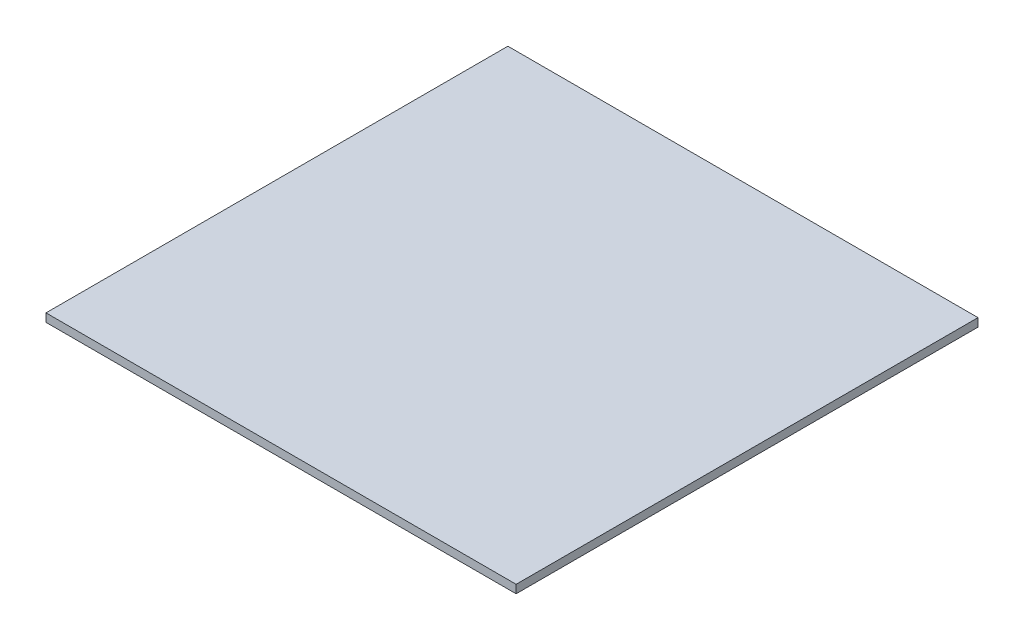
ISO-10303-21;
HEADER;
FILE_DESCRIPTION(('STEP AP214'),'2;1');
FILE_NAME('part.step','',(''),(''),'','','');
FILE_SCHEMA(('AUTOMOTIVE_DESIGN { 1 0 10303 214 1 1 1 1 }'));
ENDSEC;
DATA;
#1=APPLICATION_CONTEXT('core data for automotive mechanical design processes');
#2=APPLICATION_PROTOCOL_DEFINITION('international standard','automotive_design',2000,#1);
#3=PRODUCT_CONTEXT('',#1,'mechanical');
#4=PRODUCT('Part','Part','',(#3));
#5=PRODUCT_RELATED_PRODUCT_CATEGORY('part','',(#4));
#6=PRODUCT_DEFINITION_FORMATION('','',#4);
#7=PRODUCT_DEFINITION_CONTEXT('part definition',#1,'design');
#8=PRODUCT_DEFINITION('design','',#6,#7);
#9=PRODUCT_DEFINITION_SHAPE('','',#8);
#10=(LENGTH_UNIT() NAMED_UNIT(*) SI_UNIT(.MILLI.,.METRE.));
#11=(NAMED_UNIT(*) PLANE_ANGLE_UNIT() SI_UNIT($,.RADIAN.));
#12=(NAMED_UNIT(*) SI_UNIT($,.STERADIAN.) SOLID_ANGLE_UNIT());
#13=UNCERTAINTY_MEASURE_WITH_UNIT(LENGTH_MEASURE(1.E-05),#10,'distance_accuracy_value','');
#14=(GEOMETRIC_REPRESENTATION_CONTEXT(3) GLOBAL_UNCERTAINTY_ASSIGNED_CONTEXT((#13)) GLOBAL_UNIT_ASSIGNED_CONTEXT((#10,
#11,#12)) REPRESENTATION_CONTEXT('',''));
#15=CARTESIAN_POINT('',(0.,0.,0.));
#16=DIRECTION('',(0.,0.,1.));
#17=DIRECTION('',(1.,0.,0.));
#18=AXIS2_PLACEMENT_3D('',#15,#16,#17);
#19=CARTESIAN_POINT('',(-90.4875,3.175,88.9));
#20=DIRECTION('',(1.,0.,0.));
#21=DIRECTION('',(0.,0.,-1.));
#22=AXIS2_PLACEMENT_3D('',#19,#20,#21);
#23=PLANE('',#22);
#24=DIRECTION('',(0.,0.,1.));
#25=VECTOR('',#24,1.);
#26=CARTESIAN_POINT('',(-90.4875,0.,88.9));
#27=LINE('',#26,#25);
#28=CARTESIAN_POINT('',(-90.4875,0.,-88.9));
#29=VERTEX_POINT('',#28);
#30=CARTESIAN_POINT('',(-90.4875,0.,88.9));
#31=VERTEX_POINT('',#30);
#32=EDGE_CURVE('E107',#29,#31,#27,.T.);
#33=ORIENTED_EDGE('',*,*,#32,.T.);
#34=DIRECTION('',(0.,-1.,0.));
#35=VECTOR('',#34,1.);
#36=CARTESIAN_POINT('',(-90.4875,3.175,88.9));
#37=LINE('',#36,#35);
#38=CARTESIAN_POINT('',(-90.4875,3.175,88.9));
#39=VERTEX_POINT('',#38);
#40=EDGE_CURVE('E11',#39,#31,#37,.T.);
#41=ORIENTED_EDGE('',*,*,#40,.F.);
#42=DIRECTION('',(0.,0.,1.));
#43=VECTOR('',#42,1.);
#44=CARTESIAN_POINT('',(-90.4875,3.175,88.9));
#45=LINE('',#44,#43);
#46=CARTESIAN_POINT('',(-90.4875,3.175,-88.9));
#47=VERTEX_POINT('',#46);
#48=EDGE_CURVE('E91',#47,#39,#45,.T.);
#49=ORIENTED_EDGE('',*,*,#48,.F.);
#50=DIRECTION('',(0.,-1.,0.));
#51=VECTOR('',#50,1.);
#52=CARTESIAN_POINT('',(-90.4875,3.175,-88.9));
#53=LINE('',#52,#51);
#54=EDGE_CURVE('E103',#47,#29,#53,.T.);
#55=ORIENTED_EDGE('',*,*,#54,.T.);
#56=EDGE_LOOP('',(#33,#41,#49,#55));
#57=FACE_BOUND('',#56,.T.);
#58=ADVANCED_FACE('F39',(#57),#23,.F.);
#59=CARTESIAN_POINT('',(90.4875,3.175,88.9));
#60=DIRECTION('',(0.,0.,-1.));
#61=DIRECTION('',(-1.,0.,0.));
#62=AXIS2_PLACEMENT_3D('',#59,#60,#61);
#63=PLANE('',#62);
#64=DIRECTION('',(1.,0.,0.));
#65=VECTOR('',#64,1.);
#66=CARTESIAN_POINT('',(90.4875,0.,88.9));
#67=LINE('',#66,#65);
#68=CARTESIAN_POINT('',(90.4875,0.,88.9));
#69=VERTEX_POINT('',#68);
#70=EDGE_CURVE('E96',#31,#69,#67,.T.);
#71=ORIENTED_EDGE('',*,*,#70,.T.);
#72=DIRECTION('',(0.,-1.,0.));
#73=VECTOR('',#72,1.);
#74=CARTESIAN_POINT('',(90.4875,3.175,88.9));
#75=LINE('',#74,#73);
#76=CARTESIAN_POINT('',(90.4875,3.175,88.9));
#77=VERTEX_POINT('',#76);
#78=EDGE_CURVE('E48',#77,#69,#75,.T.);
#79=ORIENTED_EDGE('',*,*,#78,.F.);
#80=DIRECTION('',(1.,0.,0.));
#81=VECTOR('',#80,1.);
#82=CARTESIAN_POINT('',(90.4875,3.175,88.9));
#83=LINE('',#82,#81);
#84=EDGE_CURVE('E86',#39,#77,#83,.T.);
#85=ORIENTED_EDGE('',*,*,#84,.F.);
#86=ORIENTED_EDGE('',*,*,#40,.T.);
#87=EDGE_LOOP('',(#71,#79,#85,#86));
#88=FACE_BOUND('',#87,.T.);
#89=ADVANCED_FACE('F95',(#88),#63,.F.);
#90=CARTESIAN_POINT('',(90.4875,3.175,88.9));
#91=DIRECTION('',(-1.,0.,0.));
#92=DIRECTION('',(0.,0.,1.));
#93=AXIS2_PLACEMENT_3D('',#90,#91,#92);
#94=PLANE('',#93);
#95=DIRECTION('',(0.,0.,-1.));
#96=VECTOR('',#95,1.);
#97=CARTESIAN_POINT('',(90.4875,0.,88.9));
#98=LINE('',#97,#96);
#99=CARTESIAN_POINT('',(90.4875,0.,-88.9));
#100=VERTEX_POINT('',#99);
#101=EDGE_CURVE('E73',#69,#100,#98,.T.);
#102=ORIENTED_EDGE('',*,*,#101,.T.);
#103=DIRECTION('',(0.,-1.,0.));
#104=VECTOR('',#103,1.);
#105=CARTESIAN_POINT('',(90.4875,3.175,-88.9));
#106=LINE('',#105,#104);
#107=CARTESIAN_POINT('',(90.4875,3.175,-88.9));
#108=VERTEX_POINT('',#107);
#109=EDGE_CURVE('E98',#108,#100,#106,.T.);
#110=ORIENTED_EDGE('',*,*,#109,.F.);
#111=DIRECTION('',(0.,0.,-1.));
#112=VECTOR('',#111,1.);
#113=CARTESIAN_POINT('',(90.4875,3.175,88.9));
#114=LINE('',#113,#112);
#115=EDGE_CURVE('E89',#77,#108,#114,.T.);
#116=ORIENTED_EDGE('',*,*,#115,.F.);
#117=ORIENTED_EDGE('',*,*,#78,.T.);
#118=EDGE_LOOP('',(#102,#110,#116,#117));
#119=FACE_BOUND('',#118,.T.);
#120=ADVANCED_FACE('F99',(#119),#94,.F.);
#121=CARTESIAN_POINT('',(90.4875,3.175,-88.9));
#122=DIRECTION('',(0.,0.,1.));
#123=DIRECTION('',(1.,0.,0.));
#124=AXIS2_PLACEMENT_3D('',#121,#122,#123);
#125=PLANE('',#124);
#126=DIRECTION('',(-1.,0.,0.));
#127=VECTOR('',#126,1.);
#128=CARTESIAN_POINT('',(90.4875,0.,-88.9));
#129=LINE('',#128,#127);
#130=EDGE_CURVE('E79',#100,#29,#129,.T.);
#131=ORIENTED_EDGE('',*,*,#130,.T.);
#132=ORIENTED_EDGE('',*,*,#54,.F.);
#133=DIRECTION('',(-1.,0.,0.));
#134=VECTOR('',#133,1.);
#135=CARTESIAN_POINT('',(90.4875,3.175,-88.9));
#136=LINE('',#135,#134);
#137=EDGE_CURVE('E56',#108,#47,#136,.T.);
#138=ORIENTED_EDGE('',*,*,#137,.F.);
#139=ORIENTED_EDGE('',*,*,#109,.T.);
#140=EDGE_LOOP('',(#131,#132,#138,#139));
#141=FACE_BOUND('',#140,.T.);
#142=ADVANCED_FACE('F120',(#141),#125,.F.);
#143=CARTESIAN_POINT('',(0.,3.175,0.));
#144=DIRECTION('',(0.,1.,0.));
#145=DIRECTION('',(0.,0.,1.));
#146=AXIS2_PLACEMENT_3D('',#143,#144,#145);
#147=PLANE('',#146);
#148=ORIENTED_EDGE('',*,*,#48,.T.);
#149=ORIENTED_EDGE('',*,*,#84,.T.);
#150=ORIENTED_EDGE('',*,*,#115,.T.);
#151=ORIENTED_EDGE('',*,*,#137,.T.);
#152=EDGE_LOOP('',(#148,#149,#150,#151));
#153=FACE_BOUND('',#152,.T.);
#154=ADVANCED_FACE('F87',(#153),#147,.T.);
#155=CARTESIAN_POINT('',(0.,0.,0.));
#156=DIRECTION('',(0.,1.,0.));
#157=DIRECTION('',(0.,0.,1.));
#158=AXIS2_PLACEMENT_3D('',#155,#156,#157);
#159=PLANE('',#158);
#160=ORIENTED_EDGE('',*,*,#32,.F.);
#161=ORIENTED_EDGE('',*,*,#130,.F.);
#162=ORIENTED_EDGE('',*,*,#101,.F.);
#163=ORIENTED_EDGE('',*,*,#70,.F.);
#164=EDGE_LOOP('',(#160,#161,#162,#163));
#165=FACE_BOUND('',#164,.T.);
#166=ADVANCED_FACE('F123',(#165),#159,.F.);
#167=CLOSED_SHELL('',(#58,#89,#120,#142,#154,#166));
#168=MANIFOLD_SOLID_BREP('B2',#167);
#169=ADVANCED_BREP_SHAPE_REPRESENTATION('',(#18,#168),#14);
#170=SHAPE_DEFINITION_REPRESENTATION(#9,#169);
ENDSEC;
END-ISO-10303-21;
